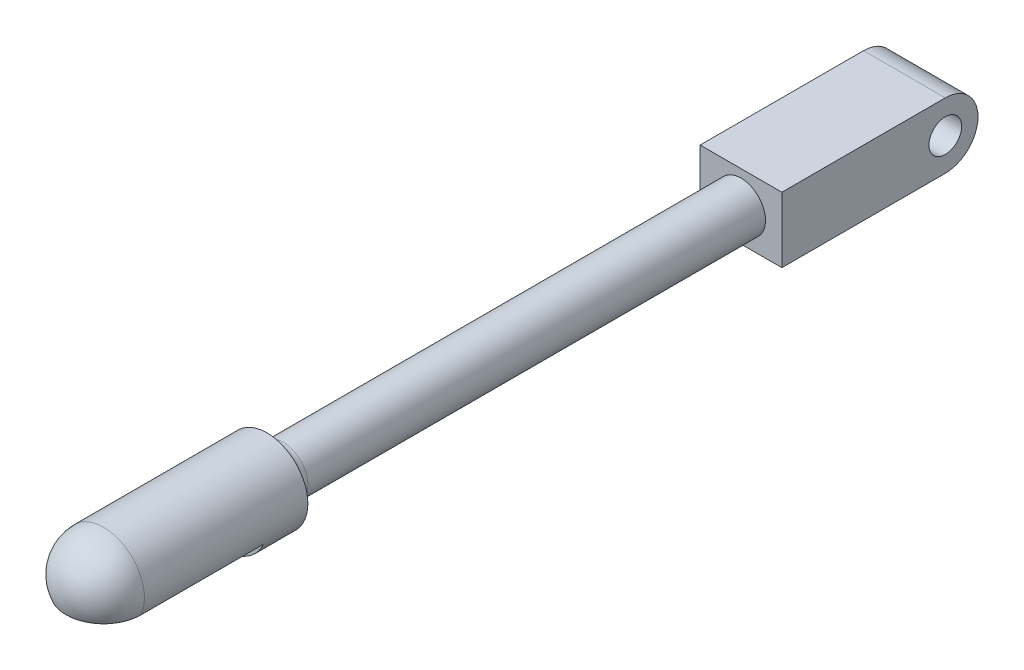
ISO-10303-21;
HEADER;
FILE_DESCRIPTION(('STEP AP214'),'2;1');
FILE_NAME('part.step','',(''),(''),'','','');
FILE_SCHEMA(('AUTOMOTIVE_DESIGN { 1 0 10303 214 1 1 1 1 }'));
ENDSEC;
DATA;
#1=APPLICATION_CONTEXT('core data for automotive mechanical design processes');
#2=APPLICATION_PROTOCOL_DEFINITION('international standard','automotive_design',2000,#1);
#3=PRODUCT_CONTEXT('',#1,'mechanical');
#4=PRODUCT('Part','Part','',(#3));
#5=PRODUCT_RELATED_PRODUCT_CATEGORY('part','',(#4));
#6=PRODUCT_DEFINITION_FORMATION('','',#4);
#7=PRODUCT_DEFINITION_CONTEXT('part definition',#1,'design');
#8=PRODUCT_DEFINITION('design','',#6,#7);
#9=PRODUCT_DEFINITION_SHAPE('','',#8);
#10=(LENGTH_UNIT() NAMED_UNIT(*) SI_UNIT(.MILLI.,.METRE.));
#11=(NAMED_UNIT(*) PLANE_ANGLE_UNIT() SI_UNIT($,.RADIAN.));
#12=(NAMED_UNIT(*) SI_UNIT($,.STERADIAN.) SOLID_ANGLE_UNIT());
#13=UNCERTAINTY_MEASURE_WITH_UNIT(LENGTH_MEASURE(1.E-05),#10,'distance_accuracy_value','');
#14=(GEOMETRIC_REPRESENTATION_CONTEXT(3) GLOBAL_UNCERTAINTY_ASSIGNED_CONTEXT((#13)) GLOBAL_UNIT_ASSIGNED_CONTEXT((#10,
#11,#12)) REPRESENTATION_CONTEXT('',''));
#15=CARTESIAN_POINT('',(0.,0.,0.));
#16=DIRECTION('',(0.,0.,1.));
#17=DIRECTION('',(1.,0.,0.));
#18=AXIS2_PLACEMENT_3D('',#15,#16,#17);
#19=CARTESIAN_POINT('',(0.,0.,24.5));
#20=DIRECTION('',(0.,0.,-1.));
#21=DIRECTION('',(-1.,0.,0.));
#22=AXIS2_PLACEMENT_3D('',#19,#20,#21);
#23=CYLINDRICAL_SURFACE('',#22,2.5);
#24=CARTESIAN_POINT('',(0.,0.,14.5));
#25=DIRECTION('',(0.,0.,1.));
#26=DIRECTION('',(1.,0.,0.));
#27=AXIS2_PLACEMENT_3D('',#24,#25,#26);
#28=CIRCLE('',#27,2.5);
#29=CARTESIAN_POINT('',(2.5,0.,14.5));
#30=VERTEX_POINT('',#29);
#31=EDGE_CURVE('E144',#30,#30,#28,.T.);
#32=ORIENTED_EDGE('',*,*,#31,.T.);
#33=EDGE_LOOP('',(#32));
#34=FACE_BOUND('',#33,.T.);
#35=DIRECTION('',(0.,0.,-1.));
#36=VECTOR('',#35,1.);
#37=CARTESIAN_POINT('',(-2.29128784747792,-1.,24.5));
#38=LINE('',#37,#36);
#39=CARTESIAN_POINT('',(-2.29128784747792,-1.,24.5));
#40=VERTEX_POINT('',#39);
#41=CARTESIAN_POINT('',(-2.29128784747792,-1.,17.));
#42=VERTEX_POINT('',#41);
#43=EDGE_CURVE('E142',#40,#42,#38,.T.);
#44=ORIENTED_EDGE('',*,*,#43,.F.);
#45=CARTESIAN_POINT('',(0.,0.,24.5));
#46=DIRECTION('',(0.,0.,1.));
#47=DIRECTION('',(1.,0.,0.));
#48=AXIS2_PLACEMENT_3D('',#45,#46,#47);
#49=CIRCLE('',#48,2.5);
#50=CARTESIAN_POINT('',(2.29128784747792,-1.,24.5));
#51=VERTEX_POINT('',#50);
#52=EDGE_CURVE('E145',#51,#40,#49,.T.);
#53=ORIENTED_EDGE('',*,*,#52,.F.);
#54=DIRECTION('',(0.,0.,-1.));
#55=VECTOR('',#54,1.);
#56=CARTESIAN_POINT('',(2.29128784747792,-1.,24.5));
#57=LINE('',#56,#55);
#58=CARTESIAN_POINT('',(2.29128784747792,-1.,17.));
#59=VERTEX_POINT('',#58);
#60=EDGE_CURVE('E53',#59,#51,#57,.F.);
#61=ORIENTED_EDGE('',*,*,#60,.F.);
#62=CARTESIAN_POINT('',(0.,0.,17.));
#63=DIRECTION('',(0.,0.,1.));
#64=DIRECTION('',(1.,0.,0.));
#65=AXIS2_PLACEMENT_3D('',#62,#63,#64);
#66=CIRCLE('',#65,2.5);
#67=EDGE_CURVE('E11',#42,#59,#66,.T.);
#68=ORIENTED_EDGE('',*,*,#67,.F.);
#69=EDGE_LOOP('',(#44,#53,#61,#68));
#70=FACE_BOUND('',#69,.T.);
#71=ADVANCED_FACE('F37',(#34,#70),#23,.T.);
#72=CARTESIAN_POINT('',(0.,0.,24.5));
#73=DIRECTION('',(0.,0.,-1.));
#74=DIRECTION('',(0.,-1.,0.));
#75=AXIS2_PLACEMENT_3D('',#72,#73,#74);
#76=SPHERICAL_SURFACE('',#75,2.5);
#77=ORIENTED_EDGE('',*,*,#52,.T.);
#78=CARTESIAN_POINT('',(0.,-1.,24.5));
#79=DIRECTION('',(0.,-1.,0.));
#80=DIRECTION('',(0.,0.,-1.));
#81=AXIS2_PLACEMENT_3D('',#78,#79,#80);
#82=CIRCLE('',#81,2.29128784747792);
#83=EDGE_CURVE('E46',#40,#51,#82,.F.);
#84=ORIENTED_EDGE('',*,*,#83,.T.);
#85=EDGE_LOOP('',(#77,#84));
#86=FACE_BOUND('',#85,.T.);
#87=ADVANCED_FACE('F155',(#86),#76,.T.);
#88=CARTESIAN_POINT('',(0.,0.,14.5));
#89=DIRECTION('',(0.,0.,-1.));
#90=DIRECTION('',(-1.,0.,0.));
#91=AXIS2_PLACEMENT_3D('',#88,#89,#90);
#92=CYLINDRICAL_SURFACE('',#91,1.5);
#93=CARTESIAN_POINT('',(0.,0.,13.5));
#94=DIRECTION('',(0.,0.,1.));
#95=DIRECTION('',(1.,0.,0.));
#96=AXIS2_PLACEMENT_3D('',#93,#94,#95);
#97=CIRCLE('',#96,1.5);
#98=CARTESIAN_POINT('',(-1.5,0.,13.5));
#99=VERTEX_POINT('',#98);
#100=EDGE_CURVE('E148',#99,#99,#97,.F.);
#101=CARTESIAN_POINT('',(0.,0.,-14.5));
#102=DIRECTION('',(0.,0.,1.));
#103=DIRECTION('',(1.,0.,0.));
#104=AXIS2_PLACEMENT_3D('',#101,#102,#103);
#105=CIRCLE('',#104,1.5);
#106=CARTESIAN_POINT('',(-1.5,0.,-14.5));
#107=VERTEX_POINT('',#106);
#108=EDGE_CURVE('E99',#107,#107,#105,.T.);
#109=CARTESIAN_POINT('',(-1.5,0.,13.5));
#110=CARTESIAN_POINT('',(-1.5,0.,13.2083333333333));
#111=CARTESIAN_POINT('',(-1.5,0.,12.9166666666667));
#112=CARTESIAN_POINT('',(-1.5,0.,12.3333333333333));
#113=CARTESIAN_POINT('',(-1.5,0.,12.0416666666667));
#114=CARTESIAN_POINT('',(-1.5,0.,11.4583333333333));
#115=CARTESIAN_POINT('',(-1.5,0.,11.1666666666667));
#116=CARTESIAN_POINT('',(-1.5,0.,10.5833333333333));
#117=CARTESIAN_POINT('',(-1.5,0.,10.2916666666667));
#118=CARTESIAN_POINT('',(-1.5,0.,9.70833333333333));
#119=CARTESIAN_POINT('',(-1.5,0.,9.41666666666667));
#120=CARTESIAN_POINT('',(-1.5,0.,8.83333333333333));
#121=CARTESIAN_POINT('',(-1.5,0.,8.54166666666667));
#122=CARTESIAN_POINT('',(-1.5,0.,7.95833333333333));
#123=CARTESIAN_POINT('',(-1.5,0.,7.66666666666667));
#124=CARTESIAN_POINT('',(-1.5,0.,7.08333333333333));
#125=CARTESIAN_POINT('',(-1.5,0.,6.79166666666667));
#126=CARTESIAN_POINT('',(-1.5,0.,6.20833333333333));
#127=CARTESIAN_POINT('',(-1.5,0.,5.91666666666667));
#128=CARTESIAN_POINT('',(-1.5,0.,5.33333333333333));
#129=CARTESIAN_POINT('',(-1.5,0.,5.04166666666667));
#130=CARTESIAN_POINT('',(-1.5,0.,4.45833333333333));
#131=CARTESIAN_POINT('',(-1.5,0.,4.16666666666667));
#132=CARTESIAN_POINT('',(-1.5,0.,3.58333333333333));
#133=CARTESIAN_POINT('',(-1.5,0.,3.29166666666667));
#134=CARTESIAN_POINT('',(-1.5,0.,2.70833333333333));
#135=CARTESIAN_POINT('',(-1.5,0.,2.41666666666667));
#136=CARTESIAN_POINT('',(-1.5,0.,1.83333333333333));
#137=CARTESIAN_POINT('',(-1.5,0.,1.54166666666667));
#138=CARTESIAN_POINT('',(-1.5,0.,0.958333333333333));
#139=CARTESIAN_POINT('',(-1.5,0.,0.666666666666667));
#140=CARTESIAN_POINT('',(-1.5,0.,0.0833333333333334));
#141=CARTESIAN_POINT('',(-1.5,0.,-0.208333333333334));
#142=CARTESIAN_POINT('',(-1.5,0.,-0.791666666666667));
#143=CARTESIAN_POINT('',(-1.5,0.,-1.08333333333333));
#144=CARTESIAN_POINT('',(-1.5,0.,-1.66666666666667));
#145=CARTESIAN_POINT('',(-1.5,0.,-1.95833333333333));
#146=CARTESIAN_POINT('',(-1.5,0.,-2.54166666666667));
#147=CARTESIAN_POINT('',(-1.5,0.,-2.83333333333333));
#148=CARTESIAN_POINT('',(-1.5,0.,-3.41666666666666));
#149=CARTESIAN_POINT('',(-1.5,0.,-3.70833333333333));
#150=CARTESIAN_POINT('',(-1.5,0.,-4.29166666666667));
#151=CARTESIAN_POINT('',(-1.5,0.,-4.58333333333333));
#152=CARTESIAN_POINT('',(-1.5,0.,-5.16666666666667));
#153=CARTESIAN_POINT('',(-1.5,0.,-5.45833333333333));
#154=CARTESIAN_POINT('',(-1.5,0.,-6.04166666666667));
#155=CARTESIAN_POINT('',(-1.5,0.,-6.33333333333333));
#156=CARTESIAN_POINT('',(-1.5,0.,-6.91666666666667));
#157=CARTESIAN_POINT('',(-1.5,0.,-7.20833333333333));
#158=CARTESIAN_POINT('',(-1.5,0.,-7.79166666666667));
#159=CARTESIAN_POINT('',(-1.5,0.,-8.08333333333333));
#160=CARTESIAN_POINT('',(-1.5,0.,-8.66666666666667));
#161=CARTESIAN_POINT('',(-1.5,0.,-8.95833333333333));
#162=CARTESIAN_POINT('',(-1.5,0.,-9.54166666666667));
#163=CARTESIAN_POINT('',(-1.5,0.,-9.83333333333333));
#164=CARTESIAN_POINT('',(-1.5,0.,-10.4166666666667));
#165=CARTESIAN_POINT('',(-1.5,0.,-10.7083333333333));
#166=CARTESIAN_POINT('',(-1.5,0.,-11.2916666666667));
#167=CARTESIAN_POINT('',(-1.5,0.,-11.5833333333333));
#168=CARTESIAN_POINT('',(-1.5,0.,-12.1666666666667));
#169=CARTESIAN_POINT('',(-1.5,0.,-12.4583333333333));
#170=CARTESIAN_POINT('',(-1.5,0.,-13.0416666666667));
#171=CARTESIAN_POINT('',(-1.5,0.,-13.3333333333333));
#172=CARTESIAN_POINT('',(-1.5,0.,-13.9166666666667));
#173=CARTESIAN_POINT('',(-1.5,0.,-14.2083333333333));
#174=CARTESIAN_POINT('',(-1.5,0.,-14.5));
#175=B_SPLINE_CURVE_WITH_KNOTS('',3,(#109,#110,#111,#112,#113,#114,#115,#116,#117,#118,#119,
#120,#121,#122,#123,#124,#125,#126,#127,#128,#129,#130,#131,#132,#133,#134,#135,#136,#137,#138,
#139,#140,#141,#142,#143,#144,#145,#146,#147,#148,#149,#150,#151,#152,#153,#154,#155,#156,#157,
#158,#159,#160,#161,#162,#163,#164,#165,#166,#167,#168,#169,#170,#171,#172,#173,#174),
.UNSPECIFIED.,.F.,.F.,(4,2,2,2,2,2,2,2,2,2,2,2,2,2,2,2,2,2,2,2,2,2,2,2,2,2,2,2,2,2,2,2,4),(0.,
0.874999999999999,1.75,2.625,3.5,4.375,5.25,6.125,7.,7.875,8.75,9.625,10.5,11.375,12.25,13.125,
14.,14.875,15.75,16.625,17.5,18.375,19.25,20.125,21.,21.875,22.75,23.625,24.5,25.375,26.25,
27.125,28.),.UNSPECIFIED.);
#176=EDGE_CURVE('BSEAM171',#99,#107,#175,.T.);
#177=ORIENTED_EDGE('',*,*,#100,.T.);
#178=ORIENTED_EDGE('',*,*,#108,.T.);
#179=ORIENTED_EDGE('',*,*,#176,.T.);
#180=ORIENTED_EDGE('',*,*,#176,.F.);
#181=EDGE_LOOP('',(#177,#179,#178,#180));
#182=FACE_BOUND('',#181,.T.);
#183=ADVANCED_FACE('F171',(#182),#92,.T.);
#184=CARTESIAN_POINT('',(0.,0.,13.5));
#185=DIRECTION('',(0.,0.,1.));
#186=DIRECTION('',(1.,0.,0.));
#187=AXIS2_PLACEMENT_3D('',#184,#185,#186);
#188=TOROIDAL_SURFACE('',#187,2.5,1.);
#189=ORIENTED_EDGE('',*,*,#100,.F.);
#190=EDGE_LOOP('',(#189));
#191=FACE_BOUND('',#190,.T.);
#192=ORIENTED_EDGE('',*,*,#31,.F.);
#193=EDGE_LOOP('',(#192));
#194=FACE_BOUND('',#193,.T.);
#195=ADVANCED_FACE('F39',(#191,#194),#188,.F.);
#196=CARTESIAN_POINT('',(0.,0.,17.));
#197=DIRECTION('',(0.,0.,1.));
#198=DIRECTION('',(1.,0.,0.));
#199=AXIS2_PLACEMENT_3D('',#196,#197,#198);
#200=PLANE('',#199);
#201=ORIENTED_EDGE('',*,*,#67,.T.);
#202=DIRECTION('',(1.,0.,0.));
#203=VECTOR('',#202,1.);
#204=CARTESIAN_POINT('',(0.,-1.,17.));
#205=LINE('',#204,#203);
#206=EDGE_CURVE('E139',#42,#59,#205,.T.);
#207=ORIENTED_EDGE('',*,*,#206,.F.);
#208=EDGE_LOOP('',(#201,#207));
#209=FACE_BOUND('',#208,.T.);
#210=ADVANCED_FACE('F161',(#209),#200,.T.);
#211=CARTESIAN_POINT('',(0.,-1.,17.));
#212=DIRECTION('',(0.,-1.,0.));
#213=DIRECTION('',(0.,0.,-1.));
#214=AXIS2_PLACEMENT_3D('',#211,#212,#213);
#215=PLANE('',#214);
#216=CARTESIAN_POINT('',(0.,-1.,24.5));
#217=DIRECTION('',(0.,-1.,0.));
#218=DIRECTION('',(0.,0.,-1.));
#219=AXIS2_PLACEMENT_3D('',#216,#217,#218);
#220=CIRCLE('',#219,1.43614066163451);
#221=CARTESIAN_POINT('',(0.,-1.,23.0638593383655));
#222=VERTEX_POINT('',#221);
#223=EDGE_CURVE('E41',#222,#222,#220,.F.);
#224=ORIENTED_EDGE('',*,*,#223,.T.);
#225=EDGE_LOOP('',(#224));
#226=FACE_BOUND('',#225,.T.);
#227=ORIENTED_EDGE('',*,*,#43,.T.);
#228=ORIENTED_EDGE('',*,*,#206,.T.);
#229=ORIENTED_EDGE('',*,*,#60,.T.);
#230=ORIENTED_EDGE('',*,*,#83,.F.);
#231=EDGE_LOOP('',(#227,#228,#229,#230));
#232=FACE_BOUND('',#231,.T.);
#233=ADVANCED_FACE('F159',(#226,#232),#215,.T.);
#234=CARTESIAN_POINT('',(0.,0.,24.5));
#235=DIRECTION('',(0.,0.,-1.));
#236=DIRECTION('',(0.,-1.,0.));
#237=AXIS2_PLACEMENT_3D('',#234,#235,#236);
#238=SPHERICAL_SURFACE('',#237,1.75);
#239=CARTESIAN_POINT('',(0.,0.,24.5));
#240=DIRECTION('',(0.,-1.,0.));
#241=DIRECTION('',(0.,0.,-1.));
#242=AXIS2_PLACEMENT_3D('',#239,#240,#241);
#243=SPHERICAL_SURFACE('',#242,1.75);
#244=ORIENTED_EDGE('',*,*,#223,.F.);
#245=EDGE_LOOP('',(#244));
#246=FACE_BOUND('',#245,.T.);
#247=ADVANCED_FACE('F168',(#246),#243,.F.);
#248=CARTESIAN_POINT('',(2.5,-2.,0.));
#249=DIRECTION('',(0.,-1.,0.));
#250=DIRECTION('',(0.,0.,-1.));
#251=AXIS2_PLACEMENT_3D('',#248,#249,#250);
#252=PLANE('',#251);
#253=DIRECTION('',(0.,0.,1.));
#254=VECTOR('',#253,1.);
#255=CARTESIAN_POINT('',(-2.5,-2.,0.));
#256=LINE('',#255,#254);
#257=CARTESIAN_POINT('',(-2.5,-2.,-24.5));
#258=VERTEX_POINT('',#257);
#259=CARTESIAN_POINT('',(-2.5,-2.,-14.5));
#260=VERTEX_POINT('',#259);
#261=EDGE_CURVE('E95',#258,#260,#256,.T.);
#262=ORIENTED_EDGE('',*,*,#261,.F.);
#263=DIRECTION('',(-1.,0.,0.));
#264=VECTOR('',#263,1.);
#265=CARTESIAN_POINT('',(2.5,-2.,-24.5));
#266=LINE('',#265,#264);
#267=CARTESIAN_POINT('',(2.5,-2.,-24.5));
#268=VERTEX_POINT('',#267);
#269=EDGE_CURVE('E88',#268,#258,#266,.T.);
#270=ORIENTED_EDGE('',*,*,#269,.F.);
#271=DIRECTION('',(0.,0.,1.));
#272=VECTOR('',#271,1.);
#273=CARTESIAN_POINT('',(2.5,-2.,0.));
#274=LINE('',#273,#272);
#275=CARTESIAN_POINT('',(2.5,-2.,-14.5));
#276=VERTEX_POINT('',#275);
#277=EDGE_CURVE('E92',#268,#276,#274,.T.);
#278=ORIENTED_EDGE('',*,*,#277,.T.);
#279=DIRECTION('',(-1.,0.,0.));
#280=VECTOR('',#279,1.);
#281=CARTESIAN_POINT('',(2.5,-2.,-14.5));
#282=LINE('',#281,#280);
#283=EDGE_CURVE('E121',#276,#260,#282,.T.);
#284=ORIENTED_EDGE('',*,*,#283,.T.);
#285=EDGE_LOOP('',(#262,#270,#278,#284));
#286=FACE_BOUND('',#285,.T.);
#287=ADVANCED_FACE('F90',(#286),#252,.T.);
#288=CARTESIAN_POINT('',(2.5,0.,-24.5));
#289=DIRECTION('',(-1.,0.,0.));
#290=DIRECTION('',(0.,0.,1.));
#291=AXIS2_PLACEMENT_3D('',#288,#289,#290);
#292=CYLINDRICAL_SURFACE('',#291,2.);
#293=CARTESIAN_POINT('',(-2.5,0.,-24.5));
#294=DIRECTION('',(1.,0.,0.));
#295=DIRECTION('',(0.,0.,-1.));
#296=AXIS2_PLACEMENT_3D('',#293,#294,#295);
#297=CIRCLE('',#296,2.);
#298=CARTESIAN_POINT('',(-2.5,2.,-24.5));
#299=VERTEX_POINT('',#298);
#300=EDGE_CURVE('E126',#258,#299,#297,.T.);
#301=ORIENTED_EDGE('',*,*,#300,.T.);
#302=DIRECTION('',(-1.,0.,0.));
#303=VECTOR('',#302,1.);
#304=CARTESIAN_POINT('',(2.5,2.,-24.5));
#305=LINE('',#304,#303);
#306=CARTESIAN_POINT('',(2.5,2.,-24.5));
#307=VERTEX_POINT('',#306);
#308=EDGE_CURVE('E100',#307,#299,#305,.T.);
#309=ORIENTED_EDGE('',*,*,#308,.F.);
#310=CARTESIAN_POINT('',(2.5,0.,-24.5));
#311=DIRECTION('',(1.,0.,0.));
#312=DIRECTION('',(0.,0.,-1.));
#313=AXIS2_PLACEMENT_3D('',#310,#311,#312);
#314=CIRCLE('',#313,2.);
#315=EDGE_CURVE('E103',#268,#307,#314,.T.);
#316=ORIENTED_EDGE('',*,*,#315,.F.);
#317=ORIENTED_EDGE('',*,*,#269,.T.);
#318=EDGE_LOOP('',(#301,#309,#316,#317));
#319=FACE_BOUND('',#318,.T.);
#320=ADVANCED_FACE('F104',(#319),#292,.T.);
#321=CARTESIAN_POINT('',(2.5,2.,0.));
#322=DIRECTION('',(0.,1.,0.));
#323=DIRECTION('',(0.,0.,1.));
#324=AXIS2_PLACEMENT_3D('',#321,#322,#323);
#325=PLANE('',#324);
#326=DIRECTION('',(0.,0.,-1.));
#327=VECTOR('',#326,1.);
#328=CARTESIAN_POINT('',(-2.5,2.,0.));
#329=LINE('',#328,#327);
#330=CARTESIAN_POINT('',(-2.5,2.,-14.5));
#331=VERTEX_POINT('',#330);
#332=EDGE_CURVE('E128',#331,#299,#329,.T.);
#333=ORIENTED_EDGE('',*,*,#332,.F.);
#334=DIRECTION('',(-1.,0.,0.));
#335=VECTOR('',#334,1.);
#336=CARTESIAN_POINT('',(2.5,2.,-14.5));
#337=LINE('',#336,#335);
#338=CARTESIAN_POINT('',(2.5,2.,-14.5));
#339=VERTEX_POINT('',#338);
#340=EDGE_CURVE('E134',#339,#331,#337,.T.);
#341=ORIENTED_EDGE('',*,*,#340,.F.);
#342=DIRECTION('',(0.,0.,-1.));
#343=VECTOR('',#342,1.);
#344=CARTESIAN_POINT('',(2.5,2.,0.));
#345=LINE('',#344,#343);
#346=EDGE_CURVE('E108',#339,#307,#345,.T.);
#347=ORIENTED_EDGE('',*,*,#346,.T.);
#348=ORIENTED_EDGE('',*,*,#308,.T.);
#349=EDGE_LOOP('',(#333,#341,#347,#348));
#350=FACE_BOUND('',#349,.T.);
#351=ADVANCED_FACE('F199',(#350),#325,.T.);
#352=CARTESIAN_POINT('',(2.5,0.,-24.5));
#353=DIRECTION('',(-1.,0.,0.));
#354=DIRECTION('',(0.,0.,1.));
#355=AXIS2_PLACEMENT_3D('',#352,#353,#354);
#356=CYLINDRICAL_SURFACE('',#355,1.);
#357=CARTESIAN_POINT('',(2.5,0.,-24.5));
#358=DIRECTION('',(1.,0.,0.));
#359=DIRECTION('',(0.,0.,-1.));
#360=AXIS2_PLACEMENT_3D('',#357,#358,#359);
#361=CIRCLE('',#360,1.);
#362=CARTESIAN_POINT('',(2.5,0.,-25.5));
#363=VERTEX_POINT('',#362);
#364=EDGE_CURVE('E113',#363,#363,#361,.T.);
#365=ORIENTED_EDGE('',*,*,#364,.T.);
#366=EDGE_LOOP('',(#365));
#367=FACE_BOUND('',#366,.T.);
#368=CARTESIAN_POINT('',(-2.5,0.,-24.5));
#369=DIRECTION('',(1.,0.,0.));
#370=DIRECTION('',(0.,0.,-1.));
#371=AXIS2_PLACEMENT_3D('',#368,#369,#370);
#372=CIRCLE('',#371,1.);
#373=CARTESIAN_POINT('',(-2.5,0.,-25.5));
#374=VERTEX_POINT('',#373);
#375=EDGE_CURVE('E122',#374,#374,#372,.T.);
#376=ORIENTED_EDGE('',*,*,#375,.F.);
#377=EDGE_LOOP('',(#376));
#378=FACE_BOUND('',#377,.T.);
#379=ADVANCED_FACE('F192',(#367,#378),#356,.F.);
#380=CARTESIAN_POINT('',(2.5,0.,-14.5));
#381=DIRECTION('',(0.,0.,1.));
#382=DIRECTION('',(1.,0.,0.));
#383=AXIS2_PLACEMENT_3D('',#380,#381,#382);
#384=PLANE('',#383);
#385=ORIENTED_EDGE('',*,*,#108,.F.);
#386=EDGE_LOOP('',(#385));
#387=FACE_BOUND('',#386,.T.);
#388=DIRECTION('',(0.,1.,0.));
#389=VECTOR('',#388,1.);
#390=CARTESIAN_POINT('',(-2.5,0.,-14.5));
#391=LINE('',#390,#389);
#392=EDGE_CURVE('E116',#260,#331,#391,.T.);
#393=ORIENTED_EDGE('',*,*,#392,.F.);
#394=ORIENTED_EDGE('',*,*,#283,.F.);
#395=DIRECTION('',(0.,1.,0.));
#396=VECTOR('',#395,1.);
#397=CARTESIAN_POINT('',(2.5,0.,-14.5));
#398=LINE('',#397,#396);
#399=EDGE_CURVE('E112',#276,#339,#398,.T.);
#400=ORIENTED_EDGE('',*,*,#399,.T.);
#401=ORIENTED_EDGE('',*,*,#340,.T.);
#402=EDGE_LOOP('',(#393,#394,#400,#401));
#403=FACE_BOUND('',#402,.T.);
#404=ADVANCED_FACE('F189',(#387,#403),#384,.T.);
#405=CARTESIAN_POINT('',(2.5,0.,0.));
#406=DIRECTION('',(1.,0.,0.));
#407=DIRECTION('',(0.,0.,-1.));
#408=AXIS2_PLACEMENT_3D('',#405,#406,#407);
#409=PLANE('',#408);
#410=ORIENTED_EDGE('',*,*,#364,.F.);
#411=EDGE_LOOP('',(#410));
#412=FACE_BOUND('',#411,.T.);
#413=ORIENTED_EDGE('',*,*,#277,.F.);
#414=ORIENTED_EDGE('',*,*,#315,.T.);
#415=ORIENTED_EDGE('',*,*,#346,.F.);
#416=ORIENTED_EDGE('',*,*,#399,.F.);
#417=EDGE_LOOP('',(#413,#414,#415,#416));
#418=FACE_BOUND('',#417,.T.);
#419=ADVANCED_FACE('F110',(#412,#418),#409,.T.);
#420=CARTESIAN_POINT('',(-2.5,0.,0.));
#421=DIRECTION('',(1.,0.,0.));
#422=DIRECTION('',(0.,0.,-1.));
#423=AXIS2_PLACEMENT_3D('',#420,#421,#422);
#424=PLANE('',#423);
#425=ORIENTED_EDGE('',*,*,#375,.T.);
#426=EDGE_LOOP('',(#425));
#427=FACE_BOUND('',#426,.T.);
#428=ORIENTED_EDGE('',*,*,#261,.T.);
#429=ORIENTED_EDGE('',*,*,#392,.T.);
#430=ORIENTED_EDGE('',*,*,#332,.T.);
#431=ORIENTED_EDGE('',*,*,#300,.F.);
#432=EDGE_LOOP('',(#428,#429,#430,#431));
#433=FACE_BOUND('',#432,.T.);
#434=ADVANCED_FACE('F197',(#427,#433),#424,.F.);
#435=CLOSED_SHELL('',(#71,#87,#183,#195,#210,#233,#247,#287,#320,#351,#379,#404,#419,#434));
#436=MANIFOLD_SOLID_BREP('B2',#435);
#437=ADVANCED_BREP_SHAPE_REPRESENTATION('',(#18,#436),#14);
#438=SHAPE_DEFINITION_REPRESENTATION(#9,#437);
ENDSEC;
END-ISO-10303-21;
